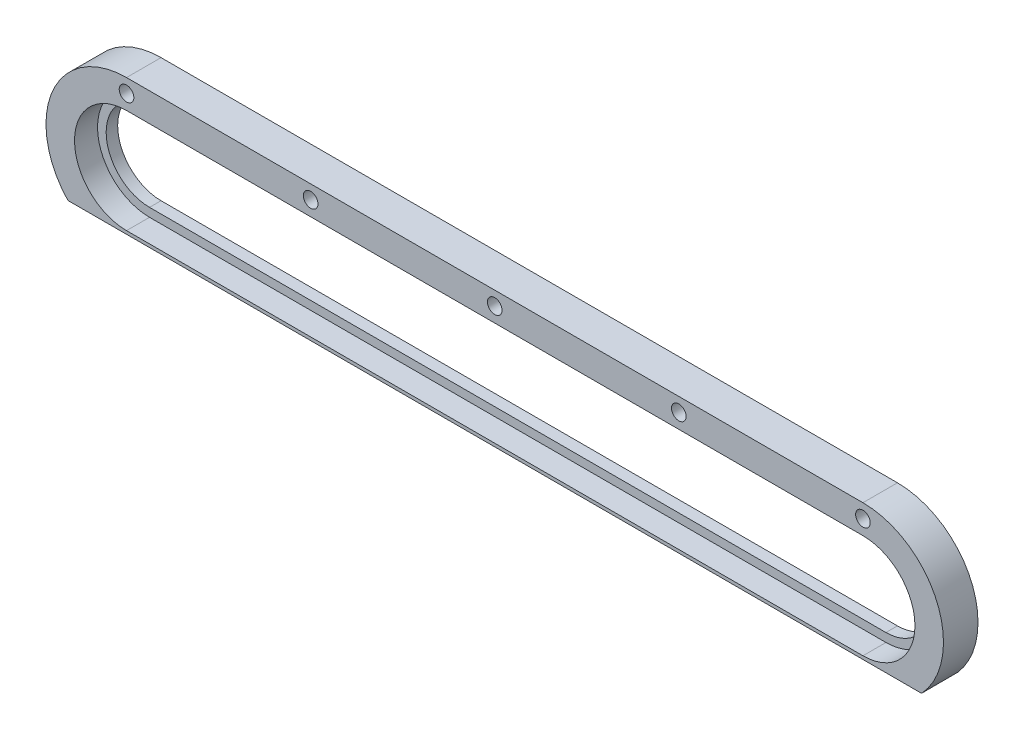
ISO-10303-21;
HEADER;
FILE_DESCRIPTION(('STEP AP214'),'2;1');
FILE_NAME('part.step','',(''),(''),'','','');
FILE_SCHEMA(('AUTOMOTIVE_DESIGN { 1 0 10303 214 1 1 1 1 }'));
ENDSEC;
DATA;
#1=APPLICATION_CONTEXT('core data for automotive mechanical design processes');
#2=APPLICATION_PROTOCOL_DEFINITION('international standard','automotive_design',2000,#1);
#3=PRODUCT_CONTEXT('',#1,'mechanical');
#4=PRODUCT('Part','Part','',(#3));
#5=PRODUCT_RELATED_PRODUCT_CATEGORY('part','',(#4));
#6=PRODUCT_DEFINITION_FORMATION('','',#4);
#7=PRODUCT_DEFINITION_CONTEXT('part definition',#1,'design');
#8=PRODUCT_DEFINITION('design','',#6,#7);
#9=PRODUCT_DEFINITION_SHAPE('','',#8);
#10=(LENGTH_UNIT() NAMED_UNIT(*) SI_UNIT(.MILLI.,.METRE.));
#11=(NAMED_UNIT(*) PLANE_ANGLE_UNIT() SI_UNIT($,.RADIAN.));
#12=(NAMED_UNIT(*) SI_UNIT($,.STERADIAN.) SOLID_ANGLE_UNIT());
#13=UNCERTAINTY_MEASURE_WITH_UNIT(LENGTH_MEASURE(1.E-05),#10,'distance_accuracy_value','');
#14=(GEOMETRIC_REPRESENTATION_CONTEXT(3) GLOBAL_UNCERTAINTY_ASSIGNED_CONTEXT((#13)) GLOBAL_UNIT_ASSIGNED_CONTEXT((#10,
#11,#12)) REPRESENTATION_CONTEXT('',''));
#15=CARTESIAN_POINT('',(0.,0.,0.));
#16=DIRECTION('',(0.,0.,1.));
#17=DIRECTION('',(1.,0.,0.));
#18=AXIS2_PLACEMENT_3D('',#15,#16,#17);
#19=CARTESIAN_POINT('',(0.,0.,9.525));
#20=DIRECTION('',(0.,0.,-1.));
#21=DIRECTION('',(-1.,0.,0.));
#22=AXIS2_PLACEMENT_3D('',#19,#20,#21);
#23=PLANE('',#22);
#24=CARTESIAN_POINT('',(-101.6,18.415,9.525));
#25=DIRECTION('',(0.,0.,1.));
#26=DIRECTION('',(1.,0.,0.));
#27=AXIS2_PLACEMENT_3D('',#24,#25,#26);
#28=CIRCLE('',#27,2.0193);
#29=CARTESIAN_POINT('',(-99.5807,18.415,9.525));
#30=VERTEX_POINT('',#29);
#31=EDGE_CURVE('E674',#30,#30,#28,.T.);
#32=ORIENTED_EDGE('',*,*,#31,.F.);
#33=EDGE_LOOP('',(#32));
#34=FACE_BOUND('',#33,.T.);
#35=CARTESIAN_POINT('',(-50.8,18.415,9.525));
#36=DIRECTION('',(0.,0.,1.));
#37=DIRECTION('',(1.,0.,0.));
#38=AXIS2_PLACEMENT_3D('',#35,#36,#37);
#39=CIRCLE('',#38,2.0193);
#40=CARTESIAN_POINT('',(-48.7807,18.415,9.525));
#41=VERTEX_POINT('',#40);
#42=EDGE_CURVE('E676',#41,#41,#39,.T.);
#43=ORIENTED_EDGE('',*,*,#42,.F.);
#44=EDGE_LOOP('',(#43));
#45=FACE_BOUND('',#44,.T.);
#46=CARTESIAN_POINT('',(0.,18.415,9.525));
#47=DIRECTION('',(0.,0.,1.));
#48=DIRECTION('',(1.,0.,0.));
#49=AXIS2_PLACEMENT_3D('',#46,#47,#48);
#50=CIRCLE('',#49,2.0193);
#51=CARTESIAN_POINT('',(2.0193,18.415,9.525));
#52=VERTEX_POINT('',#51);
#53=EDGE_CURVE('E684',#52,#52,#50,.T.);
#54=ORIENTED_EDGE('',*,*,#53,.F.);
#55=EDGE_LOOP('',(#54));
#56=FACE_BOUND('',#55,.T.);
#57=CARTESIAN_POINT('',(50.8,18.4150000000001,9.525));
#58=DIRECTION('',(0.,0.,1.));
#59=DIRECTION('',(1.,0.,0.));
#60=AXIS2_PLACEMENT_3D('',#57,#58,#59);
#61=CIRCLE('',#60,2.0193);
#62=CARTESIAN_POINT('',(52.8193,18.4150000000001,9.525));
#63=VERTEX_POINT('',#62);
#64=EDGE_CURVE('E690',#63,#63,#61,.T.);
#65=ORIENTED_EDGE('',*,*,#64,.F.);
#66=EDGE_LOOP('',(#65));
#67=FACE_BOUND('',#66,.T.);
#68=CARTESIAN_POINT('',(101.6,18.4150000000001,9.525));
#69=DIRECTION('',(0.,0.,1.));
#70=DIRECTION('',(1.,0.,0.));
#71=AXIS2_PLACEMENT_3D('',#68,#69,#70);
#72=CIRCLE('',#71,2.0193);
#73=CARTESIAN_POINT('',(103.6193,18.4150000000001,9.525));
#74=VERTEX_POINT('',#73);
#75=EDGE_CURVE('E695',#74,#74,#72,.T.);
#76=ORIENTED_EDGE('',*,*,#75,.F.);
#77=EDGE_LOOP('',(#76));
#78=FACE_BOUND('',#77,.T.);
#79=DIRECTION('',(-1.,0.,0.));
#80=VECTOR('',#79,1.);
#81=CARTESIAN_POINT('',(101.6,14.3510000000001,9.525));
#82=LINE('',#81,#80);
#83=CARTESIAN_POINT('',(101.6,14.3510000000001,9.525));
#84=VERTEX_POINT('',#83);
#85=CARTESIAN_POINT('',(-101.6,14.351,9.525));
#86=VERTEX_POINT('',#85);
#87=EDGE_CURVE('E371',#84,#86,#82,.T.);
#88=ORIENTED_EDGE('',*,*,#87,.F.);
#89=CARTESIAN_POINT('',(101.6,0.,9.525));
#90=DIRECTION('',(0.,0.,1.));
#91=DIRECTION('',(1.,0.,0.));
#92=AXIS2_PLACEMENT_3D('',#89,#90,#91);
#93=CIRCLE('',#92,14.351);
#94=CARTESIAN_POINT('',(101.6,-14.351,9.525));
#95=VERTEX_POINT('',#94);
#96=EDGE_CURVE('E352',#95,#84,#93,.T.);
#97=ORIENTED_EDGE('',*,*,#96,.F.);
#98=DIRECTION('',(1.,0.,0.));
#99=VECTOR('',#98,1.);
#100=CARTESIAN_POINT('',(101.6,-14.351,9.525));
#101=LINE('',#100,#99);
#102=CARTESIAN_POINT('',(-101.6,-14.351,9.525));
#103=VERTEX_POINT('',#102);
#104=EDGE_CURVE('E362',#103,#95,#101,.T.);
#105=ORIENTED_EDGE('',*,*,#104,.F.);
#106=CARTESIAN_POINT('',(-101.6,0.,9.525));
#107=DIRECTION('',(0.,0.,1.));
#108=DIRECTION('',(1.,0.,0.));
#109=AXIS2_PLACEMENT_3D('',#106,#107,#108);
#110=CIRCLE('',#109,14.351);
#111=EDGE_CURVE('E374',#86,#103,#110,.T.);
#112=ORIENTED_EDGE('',*,*,#111,.F.);
#113=EDGE_LOOP('',(#88,#97,#105,#112));
#114=FACE_BOUND('',#113,.T.);
#115=CARTESIAN_POINT('',(-101.6,0.,9.525));
#116=DIRECTION('',(0.,0.,1.));
#117=DIRECTION('',(1.,0.,0.));
#118=AXIS2_PLACEMENT_3D('',#115,#116,#117);
#119=CIRCLE('',#118,22.225);
#120=CARTESIAN_POINT('',(-101.6,22.225,9.525));
#121=VERTEX_POINT('',#120);
#122=CARTESIAN_POINT('',(-117.776928787628,-15.24,9.525));
#123=VERTEX_POINT('',#122);
#124=EDGE_CURVE('E261',#121,#123,#119,.T.);
#125=ORIENTED_EDGE('',*,*,#124,.T.);
#126=DIRECTION('',(1.,0.,0.));
#127=VECTOR('',#126,1.);
#128=CARTESIAN_POINT('',(0.,-15.24,9.525));
#129=LINE('',#128,#127);
#130=CARTESIAN_POINT('',(117.776928787628,-15.24,9.525));
#131=VERTEX_POINT('',#130);
#132=EDGE_CURVE('E277',#123,#131,#129,.T.);
#133=ORIENTED_EDGE('',*,*,#132,.T.);
#134=CARTESIAN_POINT('',(101.6,0.,9.525));
#135=DIRECTION('',(0.,0.,1.));
#136=DIRECTION('',(1.,0.,0.));
#137=AXIS2_PLACEMENT_3D('',#134,#135,#136);
#138=CIRCLE('',#137,22.225);
#139=CARTESIAN_POINT('',(101.6,22.225,9.525));
#140=VERTEX_POINT('',#139);
#141=EDGE_CURVE('E250',#131,#140,#138,.T.);
#142=ORIENTED_EDGE('',*,*,#141,.T.);
#143=DIRECTION('',(-1.,0.,0.));
#144=VECTOR('',#143,1.);
#145=CARTESIAN_POINT('',(123.825,22.225,9.525));
#146=LINE('',#145,#144);
#147=EDGE_CURVE('E270',#140,#121,#146,.T.);
#148=ORIENTED_EDGE('',*,*,#147,.T.);
#149=EDGE_LOOP('',(#125,#133,#142,#148));
#150=FACE_BOUND('',#149,.T.);
#151=ADVANCED_FACE('F148',(#34,#45,#56,#67,#78,#114,#150),#23,.F.);
#152=CARTESIAN_POINT('',(0.,0.,0.));
#153=DIRECTION('',(0.,0.,-1.));
#154=DIRECTION('',(-1.,0.,0.));
#155=AXIS2_PLACEMENT_3D('',#152,#153,#154);
#156=PLANE('',#155);
#157=CARTESIAN_POINT('',(-101.6,18.415,0.));
#158=DIRECTION('',(0.,0.,1.));
#159=DIRECTION('',(1.,0.,0.));
#160=AXIS2_PLACEMENT_3D('',#157,#158,#159);
#161=CIRCLE('',#160,2.0193);
#162=CARTESIAN_POINT('',(-99.5807,18.415,0.));
#163=VERTEX_POINT('',#162);
#164=EDGE_CURVE('E672',#163,#163,#161,.T.);
#165=ORIENTED_EDGE('',*,*,#164,.T.);
#166=EDGE_LOOP('',(#165));
#167=FACE_BOUND('',#166,.T.);
#168=CARTESIAN_POINT('',(-50.8,18.415,0.));
#169=DIRECTION('',(0.,0.,1.));
#170=DIRECTION('',(1.,0.,0.));
#171=AXIS2_PLACEMENT_3D('',#168,#169,#170);
#172=CIRCLE('',#171,2.0193);
#173=CARTESIAN_POINT('',(-48.7807,18.415,0.));
#174=VERTEX_POINT('',#173);
#175=EDGE_CURVE('E681',#174,#174,#172,.T.);
#176=ORIENTED_EDGE('',*,*,#175,.T.);
#177=EDGE_LOOP('',(#176));
#178=FACE_BOUND('',#177,.T.);
#179=CARTESIAN_POINT('',(0.,18.415,0.));
#180=DIRECTION('',(0.,0.,1.));
#181=DIRECTION('',(1.,0.,0.));
#182=AXIS2_PLACEMENT_3D('',#179,#180,#181);
#183=CIRCLE('',#182,2.0193);
#184=CARTESIAN_POINT('',(2.0193,18.415,0.));
#185=VERTEX_POINT('',#184);
#186=EDGE_CURVE('E687',#185,#185,#183,.T.);
#187=ORIENTED_EDGE('',*,*,#186,.T.);
#188=EDGE_LOOP('',(#187));
#189=FACE_BOUND('',#188,.T.);
#190=CARTESIAN_POINT('',(50.8,18.4150000000001,0.));
#191=DIRECTION('',(0.,0.,1.));
#192=DIRECTION('',(1.,0.,0.));
#193=AXIS2_PLACEMENT_3D('',#190,#191,#192);
#194=CIRCLE('',#193,2.0193);
#195=CARTESIAN_POINT('',(52.8193,18.4150000000001,0.));
#196=VERTEX_POINT('',#195);
#197=EDGE_CURVE('E693',#196,#196,#194,.T.);
#198=ORIENTED_EDGE('',*,*,#197,.T.);
#199=EDGE_LOOP('',(#198));
#200=FACE_BOUND('',#199,.T.);
#201=CARTESIAN_POINT('',(101.6,18.4150000000001,0.));
#202=DIRECTION('',(0.,0.,1.));
#203=DIRECTION('',(1.,0.,0.));
#204=AXIS2_PLACEMENT_3D('',#201,#202,#203);
#205=CIRCLE('',#204,2.0193);
#206=CARTESIAN_POINT('',(103.6193,18.4150000000001,0.));
#207=VERTEX_POINT('',#206);
#208=EDGE_CURVE('E306',#207,#207,#205,.T.);
#209=ORIENTED_EDGE('',*,*,#208,.T.);
#210=EDGE_LOOP('',(#209));
#211=FACE_BOUND('',#210,.T.);
#212=CARTESIAN_POINT('',(101.6,-18.415,0.));
#213=DIRECTION('',(0.,0.,1.));
#214=DIRECTION('',(1.,0.,0.));
#215=AXIS2_PLACEMENT_3D('',#212,#213,#214);
#216=CIRCLE('',#215,2.0193);
#217=CARTESIAN_POINT('',(103.6193,-18.415,0.));
#218=VERTEX_POINT('',#217);
#219=EDGE_CURVE('E296',#218,#218,#216,.T.);
#220=ORIENTED_EDGE('',*,*,#219,.T.);
#221=EDGE_LOOP('',(#220));
#222=FACE_BOUND('',#221,.T.);
#223=CARTESIAN_POINT('',(50.8,-18.415,0.));
#224=DIRECTION('',(0.,0.,1.));
#225=DIRECTION('',(1.,0.,0.));
#226=AXIS2_PLACEMENT_3D('',#223,#224,#225);
#227=CIRCLE('',#226,2.01929999999999);
#228=CARTESIAN_POINT('',(52.8193,-18.415,0.));
#229=VERTEX_POINT('',#228);
#230=EDGE_CURVE('E293',#229,#229,#227,.T.);
#231=ORIENTED_EDGE('',*,*,#230,.T.);
#232=EDGE_LOOP('',(#231));
#233=FACE_BOUND('',#232,.T.);
#234=CARTESIAN_POINT('',(0.,-18.415,0.));
#235=DIRECTION('',(0.,0.,1.));
#236=DIRECTION('',(1.,0.,0.));
#237=AXIS2_PLACEMENT_3D('',#234,#235,#236);
#238=CIRCLE('',#237,2.0193);
#239=CARTESIAN_POINT('',(2.0193,-18.415,0.));
#240=VERTEX_POINT('',#239);
#241=EDGE_CURVE('E290',#240,#240,#238,.T.);
#242=ORIENTED_EDGE('',*,*,#241,.T.);
#243=EDGE_LOOP('',(#242));
#244=FACE_BOUND('',#243,.T.);
#245=CARTESIAN_POINT('',(-50.8,-18.415,0.));
#246=DIRECTION('',(0.,0.,1.));
#247=DIRECTION('',(1.,0.,0.));
#248=AXIS2_PLACEMENT_3D('',#245,#246,#247);
#249=CIRCLE('',#248,2.0193);
#250=CARTESIAN_POINT('',(-48.7807,-18.415,0.));
#251=VERTEX_POINT('',#250);
#252=EDGE_CURVE('E286',#251,#251,#249,.T.);
#253=ORIENTED_EDGE('',*,*,#252,.T.);
#254=EDGE_LOOP('',(#253));
#255=FACE_BOUND('',#254,.T.);
#256=CARTESIAN_POINT('',(-101.6,-18.415,0.));
#257=DIRECTION('',(0.,0.,1.));
#258=DIRECTION('',(1.,0.,0.));
#259=AXIS2_PLACEMENT_3D('',#256,#257,#258);
#260=CIRCLE('',#259,2.0193);
#261=CARTESIAN_POINT('',(-99.5807,-18.415,0.));
#262=VERTEX_POINT('',#261);
#263=EDGE_CURVE('E285',#262,#262,#260,.T.);
#264=ORIENTED_EDGE('',*,*,#263,.T.);
#265=EDGE_LOOP('',(#264));
#266=FACE_BOUND('',#265,.T.);
#267=CARTESIAN_POINT('',(101.6,0.,0.));
#268=DIRECTION('',(0.,0.,1.));
#269=DIRECTION('',(1.,0.,0.));
#270=AXIS2_PLACEMENT_3D('',#267,#268,#269);
#271=CIRCLE('',#270,11.96975);
#272=CARTESIAN_POINT('',(101.6,-11.96975,0.));
#273=VERTEX_POINT('',#272);
#274=CARTESIAN_POINT('',(101.6,11.9697500000001,0.));
#275=VERTEX_POINT('',#274);
#276=EDGE_CURVE('E326',#273,#275,#271,.T.);
#277=ORIENTED_EDGE('',*,*,#276,.T.);
#278=DIRECTION('',(-1.,0.,0.));
#279=VECTOR('',#278,1.);
#280=CARTESIAN_POINT('',(101.6,11.9697500000001,0.));
#281=LINE('',#280,#279);
#282=CARTESIAN_POINT('',(-101.6,11.96975,0.));
#283=VERTEX_POINT('',#282);
#284=EDGE_CURVE('E329',#275,#283,#281,.T.);
#285=ORIENTED_EDGE('',*,*,#284,.T.);
#286=CARTESIAN_POINT('',(-101.6,0.,0.));
#287=DIRECTION('',(0.,0.,1.));
#288=DIRECTION('',(1.,0.,0.));
#289=AXIS2_PLACEMENT_3D('',#286,#287,#288);
#290=CIRCLE('',#289,11.96975);
#291=CARTESIAN_POINT('',(-101.6,-11.96975,0.));
#292=VERTEX_POINT('',#291);
#293=EDGE_CURVE('E333',#283,#292,#290,.T.);
#294=ORIENTED_EDGE('',*,*,#293,.T.);
#295=DIRECTION('',(1.,0.,0.));
#296=VECTOR('',#295,1.);
#297=CARTESIAN_POINT('',(-101.6,-11.96975,0.));
#298=LINE('',#297,#296);
#299=EDGE_CURVE('E336',#292,#273,#298,.T.);
#300=ORIENTED_EDGE('',*,*,#299,.T.);
#301=EDGE_LOOP('',(#277,#285,#294,#300));
#302=FACE_BOUND('',#301,.T.);
#303=DIRECTION('',(1.,0.,0.));
#304=VECTOR('',#303,1.);
#305=CARTESIAN_POINT('',(123.825,-22.225,0.));
#306=LINE('',#305,#304);
#307=CARTESIAN_POINT('',(-101.6,-22.225,0.));
#308=VERTEX_POINT('',#307);
#309=CARTESIAN_POINT('',(101.6,-22.225,0.));
#310=VERTEX_POINT('',#309);
#311=EDGE_CURVE('E248',#308,#310,#306,.T.);
#312=ORIENTED_EDGE('',*,*,#311,.F.);
#313=CARTESIAN_POINT('',(-101.6,0.,0.));
#314=DIRECTION('',(0.,0.,1.));
#315=DIRECTION('',(1.,0.,0.));
#316=AXIS2_PLACEMENT_3D('',#313,#314,#315);
#317=CIRCLE('',#316,22.225);
#318=CARTESIAN_POINT('',(-101.6,22.225,0.));
#319=VERTEX_POINT('',#318);
#320=EDGE_CURVE('E254',#319,#308,#317,.T.);
#321=ORIENTED_EDGE('',*,*,#320,.F.);
#322=DIRECTION('',(-1.,0.,0.));
#323=VECTOR('',#322,1.);
#324=CARTESIAN_POINT('',(123.825,22.225,0.));
#325=LINE('',#324,#323);
#326=CARTESIAN_POINT('',(101.6,22.225,0.));
#327=VERTEX_POINT('',#326);
#328=EDGE_CURVE('E267',#327,#319,#325,.T.);
#329=ORIENTED_EDGE('',*,*,#328,.F.);
#330=CARTESIAN_POINT('',(101.6,0.,0.));
#331=DIRECTION('',(0.,0.,1.));
#332=DIRECTION('',(1.,0.,0.));
#333=AXIS2_PLACEMENT_3D('',#330,#331,#332);
#334=CIRCLE('',#333,22.225);
#335=EDGE_CURVE('E266',#310,#327,#334,.T.);
#336=ORIENTED_EDGE('',*,*,#335,.F.);
#337=EDGE_LOOP('',(#312,#321,#329,#336));
#338=FACE_BOUND('',#337,.T.);
#339=ADVANCED_FACE('F264',(#167,#178,#189,#200,#211,#222,#233,#244,#255,#266,#302,#338),#156,.T.);
#340=CARTESIAN_POINT('',(123.825,-22.225,9.525));
#341=DIRECTION('',(0.,1.,0.));
#342=DIRECTION('',(-1.,0.,0.));
#343=AXIS2_PLACEMENT_3D('',#340,#341,#342);
#344=PLANE('',#343);
#345=DIRECTION('',(0.,0.,1.));
#346=VECTOR('',#345,1.);
#347=CARTESIAN_POINT('',(101.6,-22.225,0.));
#348=LINE('',#347,#346);
#349=CARTESIAN_POINT('',(101.6,-22.225,2.53999999999998));
#350=VERTEX_POINT('',#349);
#351=EDGE_CURVE('E251',#310,#350,#348,.T.);
#352=ORIENTED_EDGE('',*,*,#351,.T.);
#353=DIRECTION('',(-1.,0.,0.));
#354=VECTOR('',#353,1.);
#355=CARTESIAN_POINT('',(123.825,-22.225,2.53999999999998));
#356=LINE('',#355,#354);
#357=CARTESIAN_POINT('',(-101.6,-22.225,2.53999999999998));
#358=VERTEX_POINT('',#357);
#359=EDGE_CURVE('E157',#350,#358,#356,.T.);
#360=ORIENTED_EDGE('',*,*,#359,.T.);
#361=DIRECTION('',(0.,0.,1.));
#362=VECTOR('',#361,1.);
#363=CARTESIAN_POINT('',(-101.6,-22.225,0.));
#364=LINE('',#363,#362);
#365=EDGE_CURVE('E243',#308,#358,#364,.T.);
#366=ORIENTED_EDGE('',*,*,#365,.F.);
#367=ORIENTED_EDGE('',*,*,#311,.T.);
#368=EDGE_LOOP('',(#352,#360,#366,#367));
#369=FACE_BOUND('',#368,.T.);
#370=ADVANCED_FACE('F246',(#369),#344,.F.);
#371=CARTESIAN_POINT('',(123.825,22.225,9.525));
#372=DIRECTION('',(0.,-1.,0.));
#373=DIRECTION('',(1.,0.,0.));
#374=AXIS2_PLACEMENT_3D('',#371,#372,#373);
#375=PLANE('',#374);
#376=ORIENTED_EDGE('',*,*,#328,.T.);
#377=DIRECTION('',(0.,0.,1.));
#378=VECTOR('',#377,1.);
#379=CARTESIAN_POINT('',(-101.6,22.225,0.));
#380=LINE('',#379,#378);
#381=EDGE_CURVE('E257',#319,#121,#380,.T.);
#382=ORIENTED_EDGE('',*,*,#381,.T.);
#383=ORIENTED_EDGE('',*,*,#147,.F.);
#384=DIRECTION('',(0.,0.,1.));
#385=VECTOR('',#384,1.);
#386=CARTESIAN_POINT('',(101.6,22.225,0.));
#387=LINE('',#386,#385);
#388=EDGE_CURVE('E319',#327,#140,#387,.T.);
#389=ORIENTED_EDGE('',*,*,#388,.F.);
#390=EDGE_LOOP('',(#376,#382,#383,#389));
#391=FACE_BOUND('',#390,.T.);
#392=ADVANCED_FACE('F411',(#391),#375,.F.);
#393=CARTESIAN_POINT('',(101.6,0.,3.175));
#394=DIRECTION('',(0.,0.,1.));
#395=DIRECTION('',(1.,0.,0.));
#396=AXIS2_PLACEMENT_3D('',#393,#394,#395);
#397=CYLINDRICAL_SURFACE('',#396,14.351);
#398=ORIENTED_EDGE('',*,*,#96,.T.);
#399=DIRECTION('',(0.,0.,1.));
#400=VECTOR('',#399,1.);
#401=CARTESIAN_POINT('',(101.6,14.3510000000001,3.175));
#402=LINE('',#401,#400);
#403=CARTESIAN_POINT('',(101.6,14.3510000000001,3.175));
#404=VERTEX_POINT('',#403);
#405=EDGE_CURVE('E368',#404,#84,#402,.T.);
#406=ORIENTED_EDGE('',*,*,#405,.F.);
#407=CARTESIAN_POINT('',(101.6,0.,3.175));
#408=DIRECTION('',(0.,0.,1.));
#409=DIRECTION('',(1.,0.,0.));
#410=AXIS2_PLACEMENT_3D('',#407,#408,#409);
#411=CIRCLE('',#410,14.351);
#412=CARTESIAN_POINT('',(101.6,-14.351,3.175));
#413=VERTEX_POINT('',#412);
#414=EDGE_CURVE('E358',#413,#404,#411,.T.);
#415=ORIENTED_EDGE('',*,*,#414,.F.);
#416=DIRECTION('',(0.,0.,1.));
#417=VECTOR('',#416,1.);
#418=CARTESIAN_POINT('',(101.6,-14.351,3.175));
#419=LINE('',#418,#417);
#420=EDGE_CURVE('E268',#413,#95,#419,.T.);
#421=ORIENTED_EDGE('',*,*,#420,.T.);
#422=EDGE_LOOP('',(#398,#406,#415,#421));
#423=FACE_BOUND('',#422,.T.);
#424=ADVANCED_FACE('F389',(#423),#397,.F.);
#425=CARTESIAN_POINT('',(101.6,-14.351,3.175));
#426=DIRECTION('',(0.,-1.,0.));
#427=DIRECTION('',(1.,0.,0.));
#428=AXIS2_PLACEMENT_3D('',#425,#426,#427);
#429=PLANE('',#428);
#430=ORIENTED_EDGE('',*,*,#104,.T.);
#431=ORIENTED_EDGE('',*,*,#420,.F.);
#432=DIRECTION('',(1.,0.,0.));
#433=VECTOR('',#432,1.);
#434=CARTESIAN_POINT('',(101.6,-14.351,3.175));
#435=LINE('',#434,#433);
#436=CARTESIAN_POINT('',(-101.6,-14.351,3.175));
#437=VERTEX_POINT('',#436);
#438=EDGE_CURVE('E366',#437,#413,#435,.T.);
#439=ORIENTED_EDGE('',*,*,#438,.F.);
#440=DIRECTION('',(0.,0.,1.));
#441=VECTOR('',#440,1.);
#442=CARTESIAN_POINT('',(-101.6,-14.351,3.175));
#443=LINE('',#442,#441);
#444=EDGE_CURVE('E272',#437,#103,#443,.T.);
#445=ORIENTED_EDGE('',*,*,#444,.T.);
#446=EDGE_LOOP('',(#430,#431,#439,#445));
#447=FACE_BOUND('',#446,.T.);
#448=ADVANCED_FACE('F403',(#447),#429,.F.);
#449=CARTESIAN_POINT('',(-101.6,0.,3.175));
#450=DIRECTION('',(0.,0.,1.));
#451=DIRECTION('',(1.,0.,0.));
#452=AXIS2_PLACEMENT_3D('',#449,#450,#451);
#453=CYLINDRICAL_SURFACE('',#452,14.351);
#454=ORIENTED_EDGE('',*,*,#111,.T.);
#455=ORIENTED_EDGE('',*,*,#444,.F.);
#456=CARTESIAN_POINT('',(-101.6,0.,3.175));
#457=DIRECTION('',(0.,0.,1.));
#458=DIRECTION('',(1.,0.,0.));
#459=AXIS2_PLACEMENT_3D('',#456,#457,#458);
#460=CIRCLE('',#459,14.351);
#461=CARTESIAN_POINT('',(-101.6,14.351,3.175));
#462=VERTEX_POINT('',#461);
#463=EDGE_CURVE('E364',#462,#437,#460,.T.);
#464=ORIENTED_EDGE('',*,*,#463,.F.);
#465=DIRECTION('',(0.,0.,1.));
#466=VECTOR('',#465,1.);
#467=CARTESIAN_POINT('',(-101.6,14.351,3.175));
#468=LINE('',#467,#466);
#469=EDGE_CURVE('E380',#462,#86,#468,.T.);
#470=ORIENTED_EDGE('',*,*,#469,.T.);
#471=EDGE_LOOP('',(#454,#455,#464,#470));
#472=FACE_BOUND('',#471,.T.);
#473=ADVANCED_FACE('F397',(#472),#453,.F.);
#474=CARTESIAN_POINT('',(101.6,14.3510000000001,3.175));
#475=DIRECTION('',(0.,1.,0.));
#476=DIRECTION('',(-1.,0.,0.));
#477=AXIS2_PLACEMENT_3D('',#474,#475,#476);
#478=PLANE('',#477);
#479=ORIENTED_EDGE('',*,*,#87,.T.);
#480=ORIENTED_EDGE('',*,*,#469,.F.);
#481=DIRECTION('',(-1.,0.,0.));
#482=VECTOR('',#481,1.);
#483=CARTESIAN_POINT('',(101.6,14.3510000000001,3.175));
#484=LINE('',#483,#482);
#485=EDGE_CURVE('E361',#404,#462,#484,.T.);
#486=ORIENTED_EDGE('',*,*,#485,.F.);
#487=ORIENTED_EDGE('',*,*,#405,.T.);
#488=EDGE_LOOP('',(#479,#480,#486,#487));
#489=FACE_BOUND('',#488,.T.);
#490=ADVANCED_FACE('F383',(#489),#478,.F.);
#491=CARTESIAN_POINT('',(101.6,0.,3.175));
#492=DIRECTION('',(0.,0.,1.));
#493=DIRECTION('',(1.,0.,0.));
#494=AXIS2_PLACEMENT_3D('',#491,#492,#493);
#495=PLANE('',#494);
#496=CARTESIAN_POINT('',(101.6,0.,3.175));
#497=DIRECTION('',(0.,0.,1.));
#498=DIRECTION('',(1.,0.,0.));
#499=AXIS2_PLACEMENT_3D('',#496,#497,#498);
#500=CIRCLE('',#499,11.96975);
#501=CARTESIAN_POINT('',(101.6,-11.96975,3.175));
#502=VERTEX_POINT('',#501);
#503=CARTESIAN_POINT('',(101.6,11.9697500000001,3.175));
#504=VERTEX_POINT('',#503);
#505=EDGE_CURVE('E321',#502,#504,#500,.T.);
#506=ORIENTED_EDGE('',*,*,#505,.F.);
#507=DIRECTION('',(1.,0.,0.));
#508=VECTOR('',#507,1.);
#509=CARTESIAN_POINT('',(-101.6,-11.96975,3.175));
#510=LINE('',#509,#508);
#511=CARTESIAN_POINT('',(-101.6,-11.96975,3.175));
#512=VERTEX_POINT('',#511);
#513=EDGE_CURVE('E330',#512,#502,#510,.T.);
#514=ORIENTED_EDGE('',*,*,#513,.F.);
#515=CARTESIAN_POINT('',(-101.6,0.,3.175));
#516=DIRECTION('',(0.,0.,1.));
#517=DIRECTION('',(1.,0.,0.));
#518=AXIS2_PLACEMENT_3D('',#515,#516,#517);
#519=CIRCLE('',#518,11.96975);
#520=CARTESIAN_POINT('',(-101.6,11.96975,3.175));
#521=VERTEX_POINT('',#520);
#522=EDGE_CURVE('E345',#521,#512,#519,.T.);
#523=ORIENTED_EDGE('',*,*,#522,.F.);
#524=DIRECTION('',(-1.,0.,0.));
#525=VECTOR('',#524,1.);
#526=CARTESIAN_POINT('',(101.6,11.9697500000001,3.175));
#527=LINE('',#526,#525);
#528=EDGE_CURVE('E342',#504,#521,#527,.T.);
#529=ORIENTED_EDGE('',*,*,#528,.F.);
#530=EDGE_LOOP('',(#506,#514,#523,#529));
#531=FACE_BOUND('',#530,.T.);
#532=ORIENTED_EDGE('',*,*,#414,.T.);
#533=ORIENTED_EDGE('',*,*,#485,.T.);
#534=ORIENTED_EDGE('',*,*,#463,.T.);
#535=ORIENTED_EDGE('',*,*,#438,.T.);
#536=EDGE_LOOP('',(#532,#533,#534,#535));
#537=FACE_BOUND('',#536,.T.);
#538=ADVANCED_FACE('F401',(#531,#537),#495,.T.);
#539=CARTESIAN_POINT('',(101.6,0.,0.));
#540=DIRECTION('',(0.,0.,1.));
#541=DIRECTION('',(1.,0.,0.));
#542=AXIS2_PLACEMENT_3D('',#539,#540,#541);
#543=CYLINDRICAL_SURFACE('',#542,11.96975);
#544=ORIENTED_EDGE('',*,*,#505,.T.);
#545=DIRECTION('',(0.,0.,1.));
#546=VECTOR('',#545,1.);
#547=CARTESIAN_POINT('',(101.6,11.9697500000001,0.));
#548=LINE('',#547,#546);
#549=EDGE_CURVE('E339',#275,#504,#548,.T.);
#550=ORIENTED_EDGE('',*,*,#549,.F.);
#551=ORIENTED_EDGE('',*,*,#276,.F.);
#552=DIRECTION('',(0.,0.,1.));
#553=VECTOR('',#552,1.);
#554=CARTESIAN_POINT('',(101.6,-11.96975,0.));
#555=LINE('',#554,#553);
#556=EDGE_CURVE('E350',#273,#502,#555,.T.);
#557=ORIENTED_EDGE('',*,*,#556,.T.);
#558=EDGE_LOOP('',(#544,#550,#551,#557));
#559=FACE_BOUND('',#558,.T.);
#560=ADVANCED_FACE('F467',(#559),#543,.F.);
#561=CARTESIAN_POINT('',(-101.6,-11.96975,0.));
#562=DIRECTION('',(0.,-1.,0.));
#563=DIRECTION('',(1.,0.,0.));
#564=AXIS2_PLACEMENT_3D('',#561,#562,#563);
#565=PLANE('',#564);
#566=ORIENTED_EDGE('',*,*,#513,.T.);
#567=ORIENTED_EDGE('',*,*,#556,.F.);
#568=ORIENTED_EDGE('',*,*,#299,.F.);
#569=DIRECTION('',(0.,0.,1.));
#570=VECTOR('',#569,1.);
#571=CARTESIAN_POINT('',(-101.6,-11.96975,0.));
#572=LINE('',#571,#570);
#573=EDGE_CURVE('E353',#292,#512,#572,.T.);
#574=ORIENTED_EDGE('',*,*,#573,.T.);
#575=EDGE_LOOP('',(#566,#567,#568,#574));
#576=FACE_BOUND('',#575,.T.);
#577=ADVANCED_FACE('F476',(#576),#565,.F.);
#578=CARTESIAN_POINT('',(-101.6,0.,0.));
#579=DIRECTION('',(0.,0.,1.));
#580=DIRECTION('',(1.,0.,0.));
#581=AXIS2_PLACEMENT_3D('',#578,#579,#580);
#582=CYLINDRICAL_SURFACE('',#581,11.96975);
#583=ORIENTED_EDGE('',*,*,#522,.T.);
#584=ORIENTED_EDGE('',*,*,#573,.F.);
#585=ORIENTED_EDGE('',*,*,#293,.F.);
#586=DIRECTION('',(0.,0.,1.));
#587=VECTOR('',#586,1.);
#588=CARTESIAN_POINT('',(-101.6,11.96975,0.));
#589=LINE('',#588,#587);
#590=EDGE_CURVE('E355',#283,#521,#589,.T.);
#591=ORIENTED_EDGE('',*,*,#590,.T.);
#592=EDGE_LOOP('',(#583,#584,#585,#591));
#593=FACE_BOUND('',#592,.T.);
#594=ADVANCED_FACE('F486',(#593),#582,.F.);
#595=CARTESIAN_POINT('',(101.6,11.9697500000001,0.));
#596=DIRECTION('',(0.,1.,0.));
#597=DIRECTION('',(-1.,0.,0.));
#598=AXIS2_PLACEMENT_3D('',#595,#596,#597);
#599=PLANE('',#598);
#600=ORIENTED_EDGE('',*,*,#528,.T.);
#601=ORIENTED_EDGE('',*,*,#590,.F.);
#602=ORIENTED_EDGE('',*,*,#284,.F.);
#603=ORIENTED_EDGE('',*,*,#549,.T.);
#604=EDGE_LOOP('',(#600,#601,#602,#603));
#605=FACE_BOUND('',#604,.T.);
#606=ADVANCED_FACE('F496',(#605),#599,.F.);
#607=CARTESIAN_POINT('',(101.6,0.,0.));
#608=DIRECTION('',(0.,0.,1.));
#609=DIRECTION('',(1.,0.,0.));
#610=AXIS2_PLACEMENT_3D('',#607,#608,#609);
#611=CYLINDRICAL_SURFACE('',#610,22.225);
#612=ORIENTED_EDGE('',*,*,#141,.F.);
#613=CARTESIAN_POINT('',(101.6,0.,24.765));
#614=DIRECTION('',(0.,0.707106781186548,-0.707106781186548));
#615=DIRECTION('',(0.,0.707106781186547,0.707106781186548));
#616=AXIS2_PLACEMENT_3D('',#613,#614,#615);
#617=ELLIPSE('',#616,31.4308964237421,22.225);
#618=EDGE_CURVE('E171',#131,#350,#617,.T.);
#619=ORIENTED_EDGE('',*,*,#618,.T.);
#620=ORIENTED_EDGE('',*,*,#351,.F.);
#621=ORIENTED_EDGE('',*,*,#335,.T.);
#622=ORIENTED_EDGE('',*,*,#388,.T.);
#623=EDGE_LOOP('',(#612,#619,#620,#621,#622));
#624=FACE_BOUND('',#623,.T.);
#625=ADVANCED_FACE('F506',(#624),#611,.T.);
#626=CARTESIAN_POINT('',(-101.6,0.,0.));
#627=DIRECTION('',(0.,0.,1.));
#628=DIRECTION('',(1.,0.,0.));
#629=AXIS2_PLACEMENT_3D('',#626,#627,#628);
#630=CYLINDRICAL_SURFACE('',#629,22.225);
#631=ORIENTED_EDGE('',*,*,#365,.T.);
#632=CARTESIAN_POINT('',(-101.6,0.,24.765));
#633=DIRECTION('',(0.,0.707106781186548,-0.707106781186548));
#634=DIRECTION('',(0.,0.707106781186547,0.707106781186548));
#635=AXIS2_PLACEMENT_3D('',#632,#633,#634);
#636=ELLIPSE('',#635,31.430896423742,22.225);
#637=EDGE_CURVE('E12',#358,#123,#636,.T.);
#638=ORIENTED_EDGE('',*,*,#637,.T.);
#639=ORIENTED_EDGE('',*,*,#124,.F.);
#640=ORIENTED_EDGE('',*,*,#381,.F.);
#641=ORIENTED_EDGE('',*,*,#320,.T.);
#642=EDGE_LOOP('',(#631,#638,#639,#640,#641));
#643=FACE_BOUND('',#642,.T.);
#644=ADVANCED_FACE('F255',(#643),#630,.T.);
#645=CARTESIAN_POINT('',(-101.6,-18.415,9.525));
#646=DIRECTION('',(0.,0.,1.));
#647=DIRECTION('',(1.,0.,0.));
#648=AXIS2_PLACEMENT_3D('',#645,#646,#647);
#649=CYLINDRICAL_SURFACE('',#648,2.0193);
#650=ORIENTED_EDGE('',*,*,#263,.F.);
#651=EDGE_LOOP('',(#650));
#652=FACE_BOUND('',#651,.T.);
#653=CARTESIAN_POINT('',(-101.6,-18.415,6.34999999999998));
#654=DIRECTION('',(0.,0.707106781186548,-0.707106781186548));
#655=DIRECTION('',(0.,0.707106781186547,0.707106781186548));
#656=AXIS2_PLACEMENT_3D('',#653,#654,#655);
#657=ELLIPSE('',#656,2.85572144649999,2.0193);
#658=CARTESIAN_POINT('',(-101.6,-16.3957,8.36929999999998));
#659=VERTEX_POINT('',#658);
#660=EDGE_CURVE('E282',#659,#659,#657,.F.);
#661=ORIENTED_EDGE('',*,*,#660,.T.);
#662=EDGE_LOOP('',(#661));
#663=FACE_BOUND('',#662,.T.);
#664=ADVANCED_FACE('F526',(#652,#663),#649,.F.);
#665=CARTESIAN_POINT('',(-50.8,-18.415,9.525));
#666=DIRECTION('',(0.,0.,1.));
#667=DIRECTION('',(1.,0.,0.));
#668=AXIS2_PLACEMENT_3D('',#665,#666,#667);
#669=CYLINDRICAL_SURFACE('',#668,2.0193);
#670=ORIENTED_EDGE('',*,*,#252,.F.);
#671=EDGE_LOOP('',(#670));
#672=FACE_BOUND('',#671,.T.);
#673=CARTESIAN_POINT('',(-50.8,-18.415,6.34999999999998));
#674=DIRECTION('',(0.,0.707106781186548,-0.707106781186548));
#675=DIRECTION('',(0.,0.707106781186547,0.707106781186548));
#676=AXIS2_PLACEMENT_3D('',#673,#674,#675);
#677=ELLIPSE('',#676,2.85572144649999,2.0193);
#678=CARTESIAN_POINT('',(-50.8,-16.3957,8.36929999999998));
#679=VERTEX_POINT('',#678);
#680=EDGE_CURVE('E287',#679,#679,#677,.F.);
#681=ORIENTED_EDGE('',*,*,#680,.T.);
#682=EDGE_LOOP('',(#681));
#683=FACE_BOUND('',#682,.T.);
#684=ADVANCED_FACE('F536',(#672,#683),#669,.F.);
#685=CARTESIAN_POINT('',(0.,-18.415,9.525));
#686=DIRECTION('',(0.,0.,1.));
#687=DIRECTION('',(1.,0.,0.));
#688=AXIS2_PLACEMENT_3D('',#685,#686,#687);
#689=CYLINDRICAL_SURFACE('',#688,2.0193);
#690=ORIENTED_EDGE('',*,*,#241,.F.);
#691=EDGE_LOOP('',(#690));
#692=FACE_BOUND('',#691,.T.);
#693=CARTESIAN_POINT('',(0.,-18.415,6.34999999999998));
#694=DIRECTION('',(0.,0.707106781186548,-0.707106781186548));
#695=DIRECTION('',(0.,0.707106781186547,0.707106781186548));
#696=AXIS2_PLACEMENT_3D('',#693,#694,#695);
#697=ELLIPSE('',#696,2.85572144649999,2.0193);
#698=CARTESIAN_POINT('',(0.,-16.3957,8.36929999999998));
#699=VERTEX_POINT('',#698);
#700=EDGE_CURVE('E291',#699,#699,#697,.F.);
#701=ORIENTED_EDGE('',*,*,#700,.T.);
#702=EDGE_LOOP('',(#701));
#703=FACE_BOUND('',#702,.T.);
#704=ADVANCED_FACE('F545',(#692,#703),#689,.F.);
#705=CARTESIAN_POINT('',(50.8,-18.415,9.525));
#706=DIRECTION('',(0.,0.,1.));
#707=DIRECTION('',(1.,0.,0.));
#708=AXIS2_PLACEMENT_3D('',#705,#706,#707);
#709=CYLINDRICAL_SURFACE('',#708,2.0193);
#710=ORIENTED_EDGE('',*,*,#230,.F.);
#711=EDGE_LOOP('',(#710));
#712=FACE_BOUND('',#711,.T.);
#713=CARTESIAN_POINT('',(50.8,-18.415,6.34999999999998));
#714=DIRECTION('',(0.,0.707106781186548,-0.707106781186548));
#715=DIRECTION('',(0.,0.707106781186547,0.707106781186548));
#716=AXIS2_PLACEMENT_3D('',#713,#714,#715);
#717=ELLIPSE('',#716,2.85572144649999,2.0193);
#718=CARTESIAN_POINT('',(50.8,-16.3957,8.36929999999998));
#719=VERTEX_POINT('',#718);
#720=EDGE_CURVE('E294',#719,#719,#717,.F.);
#721=ORIENTED_EDGE('',*,*,#720,.T.);
#722=EDGE_LOOP('',(#721));
#723=FACE_BOUND('',#722,.T.);
#724=ADVANCED_FACE('F555',(#712,#723),#709,.F.);
#725=CARTESIAN_POINT('',(101.6,-18.415,9.525));
#726=DIRECTION('',(0.,0.,1.));
#727=DIRECTION('',(1.,0.,0.));
#728=AXIS2_PLACEMENT_3D('',#725,#726,#727);
#729=CYLINDRICAL_SURFACE('',#728,2.0193);
#730=ORIENTED_EDGE('',*,*,#219,.F.);
#731=EDGE_LOOP('',(#730));
#732=FACE_BOUND('',#731,.T.);
#733=CARTESIAN_POINT('',(101.6,-18.415,6.34999999999998));
#734=DIRECTION('',(0.,0.707106781186548,-0.707106781186548));
#735=DIRECTION('',(0.,0.707106781186547,0.707106781186548));
#736=AXIS2_PLACEMENT_3D('',#733,#734,#735);
#737=ELLIPSE('',#736,2.85572144649999,2.0193);
#738=CARTESIAN_POINT('',(101.6,-16.3957,8.36929999999998));
#739=VERTEX_POINT('',#738);
#740=EDGE_CURVE('E152',#739,#739,#737,.F.);
#741=ORIENTED_EDGE('',*,*,#740,.T.);
#742=EDGE_LOOP('',(#741));
#743=FACE_BOUND('',#742,.T.);
#744=ADVANCED_FACE('F565',(#732,#743),#729,.F.);
#745=CARTESIAN_POINT('',(101.6,18.4150000000001,9.525));
#746=DIRECTION('',(0.,0.,1.));
#747=DIRECTION('',(1.,0.,0.));
#748=AXIS2_PLACEMENT_3D('',#745,#746,#747);
#749=CYLINDRICAL_SURFACE('',#748,2.0193);
#750=ORIENTED_EDGE('',*,*,#208,.F.);
#751=EDGE_LOOP('',(#750));
#752=FACE_BOUND('',#751,.T.);
#753=ORIENTED_EDGE('',*,*,#75,.T.);
#754=EDGE_LOOP('',(#753));
#755=FACE_BOUND('',#754,.T.);
#756=ADVANCED_FACE('F575',(#752,#755),#749,.F.);
#757=CARTESIAN_POINT('',(50.8,18.4150000000001,9.525));
#758=DIRECTION('',(0.,0.,1.));
#759=DIRECTION('',(1.,0.,0.));
#760=AXIS2_PLACEMENT_3D('',#757,#758,#759);
#761=CYLINDRICAL_SURFACE('',#760,2.0193);
#762=ORIENTED_EDGE('',*,*,#197,.F.);
#763=EDGE_LOOP('',(#762));
#764=FACE_BOUND('',#763,.T.);
#765=ORIENTED_EDGE('',*,*,#64,.T.);
#766=EDGE_LOOP('',(#765));
#767=FACE_BOUND('',#766,.T.);
#768=ADVANCED_FACE('F585',(#764,#767),#761,.F.);
#769=CARTESIAN_POINT('',(0.,18.415,9.525));
#770=DIRECTION('',(0.,0.,1.));
#771=DIRECTION('',(1.,0.,0.));
#772=AXIS2_PLACEMENT_3D('',#769,#770,#771);
#773=CYLINDRICAL_SURFACE('',#772,2.0193);
#774=ORIENTED_EDGE('',*,*,#186,.F.);
#775=EDGE_LOOP('',(#774));
#776=FACE_BOUND('',#775,.T.);
#777=ORIENTED_EDGE('',*,*,#53,.T.);
#778=EDGE_LOOP('',(#777));
#779=FACE_BOUND('',#778,.T.);
#780=ADVANCED_FACE('F595',(#776,#779),#773,.F.);
#781=CARTESIAN_POINT('',(-50.8,18.415,9.525));
#782=DIRECTION('',(0.,0.,1.));
#783=DIRECTION('',(1.,0.,0.));
#784=AXIS2_PLACEMENT_3D('',#781,#782,#783);
#785=CYLINDRICAL_SURFACE('',#784,2.0193);
#786=ORIENTED_EDGE('',*,*,#175,.F.);
#787=EDGE_LOOP('',(#786));
#788=FACE_BOUND('',#787,.T.);
#789=ORIENTED_EDGE('',*,*,#42,.T.);
#790=EDGE_LOOP('',(#789));
#791=FACE_BOUND('',#790,.T.);
#792=ADVANCED_FACE('F605',(#788,#791),#785,.F.);
#793=CARTESIAN_POINT('',(-101.6,18.415,9.525));
#794=DIRECTION('',(0.,0.,1.));
#795=DIRECTION('',(1.,0.,0.));
#796=AXIS2_PLACEMENT_3D('',#793,#794,#795);
#797=CYLINDRICAL_SURFACE('',#796,2.0193);
#798=ORIENTED_EDGE('',*,*,#164,.F.);
#799=EDGE_LOOP('',(#798));
#800=FACE_BOUND('',#799,.T.);
#801=ORIENTED_EDGE('',*,*,#31,.T.);
#802=EDGE_LOOP('',(#801));
#803=FACE_BOUND('',#802,.T.);
#804=ADVANCED_FACE('F615',(#800,#803),#797,.F.);
#805=CARTESIAN_POINT('',(0.,-15.24,9.525));
#806=DIRECTION('',(0.,0.707106781186548,-0.707106781186548));
#807=DIRECTION('',(1.,0.,0.));
#808=AXIS2_PLACEMENT_3D('',#805,#806,#807);
#809=PLANE('',#808);
#810=ORIENTED_EDGE('',*,*,#637,.F.);
#811=ORIENTED_EDGE('',*,*,#359,.F.);
#812=ORIENTED_EDGE('',*,*,#618,.F.);
#813=ORIENTED_EDGE('',*,*,#132,.F.);
#814=EDGE_LOOP('',(#810,#811,#812,#813));
#815=FACE_BOUND('',#814,.T.);
#816=ORIENTED_EDGE('',*,*,#660,.F.);
#817=EDGE_LOOP('',(#816));
#818=FACE_BOUND('',#817,.T.);
#819=ORIENTED_EDGE('',*,*,#680,.F.);
#820=EDGE_LOOP('',(#819));
#821=FACE_BOUND('',#820,.T.);
#822=ORIENTED_EDGE('',*,*,#700,.F.);
#823=EDGE_LOOP('',(#822));
#824=FACE_BOUND('',#823,.T.);
#825=ORIENTED_EDGE('',*,*,#720,.F.);
#826=EDGE_LOOP('',(#825));
#827=FACE_BOUND('',#826,.T.);
#828=ORIENTED_EDGE('',*,*,#740,.F.);
#829=EDGE_LOOP('',(#828));
#830=FACE_BOUND('',#829,.T.);
#831=ADVANCED_FACE('F150',(#815,#818,#821,#824,#827,#830),#809,.F.);
#832=CLOSED_SHELL('',(#151,#339,#370,#392,#424,#448,#473,#490,#538,#560,#577,#594,#606,#625,
#644,#664,#684,#704,#724,#744,#756,#768,#780,#792,#804,#831));
#833=MANIFOLD_SOLID_BREP('B2',#832);
#834=ADVANCED_BREP_SHAPE_REPRESENTATION('',(#18,#833),#14);
#835=SHAPE_DEFINITION_REPRESENTATION(#9,#834);
ENDSEC;
END-ISO-10303-21;
